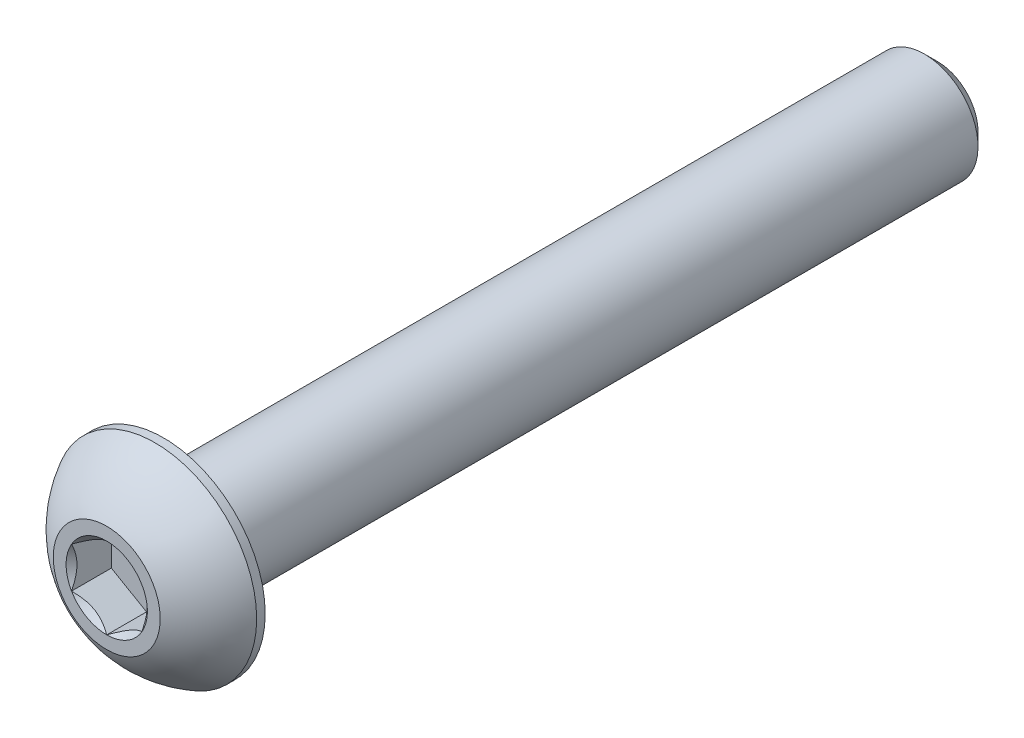
ISO-10303-21;
HEADER;
FILE_DESCRIPTION(('STEP AP214'),'2;1');
FILE_NAME('part.step','',(''),(''),'','','');
FILE_SCHEMA(('AUTOMOTIVE_DESIGN { 1 0 10303 214 1 1 1 1 }'));
ENDSEC;
DATA;
#1=APPLICATION_CONTEXT('core data for automotive mechanical design processes');
#2=APPLICATION_PROTOCOL_DEFINITION('international standard','automotive_design',2000,#1);
#3=PRODUCT_CONTEXT('',#1,'mechanical');
#4=PRODUCT('Part','Part','',(#3));
#5=PRODUCT_RELATED_PRODUCT_CATEGORY('part','',(#4));
#6=PRODUCT_DEFINITION_FORMATION('','',#4);
#7=PRODUCT_DEFINITION_CONTEXT('part definition',#1,'design');
#8=PRODUCT_DEFINITION('design','',#6,#7);
#9=PRODUCT_DEFINITION_SHAPE('','',#8);
#10=(LENGTH_UNIT() NAMED_UNIT(*) SI_UNIT(.MILLI.,.METRE.));
#11=(NAMED_UNIT(*) PLANE_ANGLE_UNIT() SI_UNIT($,.RADIAN.));
#12=(NAMED_UNIT(*) SI_UNIT($,.STERADIAN.) SOLID_ANGLE_UNIT());
#13=UNCERTAINTY_MEASURE_WITH_UNIT(LENGTH_MEASURE(1.E-05),#10,'distance_accuracy_value','');
#14=(GEOMETRIC_REPRESENTATION_CONTEXT(3) GLOBAL_UNCERTAINTY_ASSIGNED_CONTEXT((#13)) GLOBAL_UNIT_ASSIGNED_CONTEXT((#10,
#11,#12)) REPRESENTATION_CONTEXT('',''));
#15=CARTESIAN_POINT('',(0.,0.,0.));
#16=DIRECTION('',(0.,0.,1.));
#17=DIRECTION('',(1.,0.,0.));
#18=AXIS2_PLACEMENT_3D('',#15,#16,#17);
#19=CARTESIAN_POINT('',(0.,-2.413,-37.4904));
#20=DIRECTION('',(0.,0.,-1.));
#21=DIRECTION('',(0.,1.,0.));
#22=AXIS2_PLACEMENT_3D('',#19,#20,#21);
#23=PLANE('',#22);
#24=CARTESIAN_POINT('',(0.,0.,-37.4904));
#25=DIRECTION('',(0.,0.,-1.));
#26=DIRECTION('',(0.,1.,0.));
#27=AXIS2_PLACEMENT_3D('',#24,#25,#26);
#28=CIRCLE('',#27,1.8176875);
#29=CARTESIAN_POINT('',(0.,1.8176875,-37.4904));
#30=VERTEX_POINT('',#29);
#31=EDGE_CURVE('E44',#30,#30,#28,.T.);
#32=ORIENTED_EDGE('',*,*,#31,.T.);
#33=EDGE_LOOP('',(#32));
#34=FACE_BOUND('',#33,.T.);
#35=ADVANCED_FACE('F36',(#34),#23,.T.);
#36=CARTESIAN_POINT('',(0.,0.,-37.4904));
#37=DIRECTION('',(0.,0.,-1.));
#38=DIRECTION('',(0.,1.,0.));
#39=AXIS2_PLACEMENT_3D('',#36,#37,#38);
#40=CYLINDRICAL_SURFACE('',#39,2.413);
#41=CARTESIAN_POINT('',(0.,0.,-36.8950875));
#42=DIRECTION('',(0.,0.,-1.));
#43=DIRECTION('',(0.,1.,0.));
#44=AXIS2_PLACEMENT_3D('',#41,#42,#43);
#45=CIRCLE('',#44,2.413);
#46=CARTESIAN_POINT('',(0.,2.413,-36.8950875));
#47=VERTEX_POINT('',#46);
#48=EDGE_CURVE('E11',#47,#47,#45,.F.);
#49=ORIENTED_EDGE('',*,*,#48,.T.);
#50=EDGE_LOOP('',(#49));
#51=FACE_BOUND('',#50,.T.);
#52=CARTESIAN_POINT('',(0.,0.,-2.5654));
#53=DIRECTION('',(0.,0.,1.));
#54=DIRECTION('',(1.,0.,0.));
#55=AXIS2_PLACEMENT_3D('',#52,#53,#54);
#56=CIRCLE('',#55,2.413);
#57=CARTESIAN_POINT('',(2.413,0.,-2.5654));
#58=VERTEX_POINT('',#57);
#59=EDGE_CURVE('E170',#58,#58,#56,.F.);
#60=ORIENTED_EDGE('',*,*,#59,.T.);
#61=EDGE_LOOP('',(#60));
#62=FACE_BOUND('',#61,.T.);
#63=ADVANCED_FACE('F178',(#51,#62),#40,.T.);
#64=CARTESIAN_POINT('',(0.,0.,-37.4904));
#65=DIRECTION('',(0.,0.,1.));
#66=DIRECTION('',(0.,-1.,0.));
#67=AXIS2_PLACEMENT_3D('',#64,#65,#66);
#68=CONICAL_SURFACE('',#67,1.8176875,0.785398163397443);
#69=ORIENTED_EDGE('',*,*,#48,.F.);
#70=EDGE_LOOP('',(#69));
#71=FACE_BOUND('',#70,.T.);
#72=ORIENTED_EDGE('',*,*,#31,.F.);
#73=EDGE_LOOP('',(#72));
#74=FACE_BOUND('',#73,.T.);
#75=ADVANCED_FACE('F38',(#71,#74),#68,.T.);
#76=CARTESIAN_POINT('',(0.,0.,-4.5748806144438));
#77=DIRECTION('',(0.,0.,1.));
#78=DIRECTION('',(0.,-1.,0.));
#79=AXIS2_PLACEMENT_3D('',#76,#77,#78);
#80=SPHERICAL_SURFACE('',#79,5.17224338526463);
#81=CARTESIAN_POINT('',(0.,0.,0.));
#82=DIRECTION('',(0.,0.,1.));
#83=DIRECTION('',(1.,0.,0.));
#84=AXIS2_PLACEMENT_3D('',#81,#82,#83);
#85=CIRCLE('',#84,2.413);
#86=CARTESIAN_POINT('',(0.,-2.413,0.));
#87=VERTEX_POINT('',#86);
#88=EDGE_CURVE('E167',#87,#87,#85,.T.);
#89=CARTESIAN_POINT('',(0.,0.,-2.18059));
#90=DIRECTION('',(0.,0.,1.));
#91=DIRECTION('',(1.,0.,0.));
#92=AXIS2_PLACEMENT_3D('',#89,#90,#91);
#93=CIRCLE('',#92,4.5847);
#94=CARTESIAN_POINT('',(0.,-4.5847,-2.18059));
#95=VERTEX_POINT('',#94);
#96=EDGE_CURVE('E161',#95,#95,#93,.T.);
#97=CARTESIAN_POINT('',(0.,-2.413,0.));
#98=CARTESIAN_POINT('',(0.,-2.44179113663083,-0.0151857097788009));
#99=CARTESIAN_POINT('',(0.,-2.47043888331474,-0.0306432741933343));
#100=CARTESIAN_POINT('',(0.,-2.5274374690351,-0.0620964513369402));
#101=CARTESIAN_POINT('',(0.,-2.55578830807155,-0.0780920640660127));
#102=CARTESIAN_POINT('',(0.,-2.61218295074331,-0.110615676881771));
#103=CARTESIAN_POINT('',(0.,-2.64022675437863,-0.127143676968457));
#104=CARTESIAN_POINT('',(0.,-2.69599733629138,-0.160726162390165));
#105=CARTESIAN_POINT('',(0.,-2.72372411456882,-0.177780647725188));
#106=CARTESIAN_POINT('',(0.,-2.77885076121154,-0.21241002764294));
#107=CARTESIAN_POINT('',(0.,-2.80625062957682,-0.229984922225668));
#108=CARTESIAN_POINT('',(0.,-2.86071369040082,-0.265648855453746));
#109=CARTESIAN_POINT('',(0.,-2.88777688285954,-0.283737894099096));
#110=CARTESIAN_POINT('',(0.,-2.94155694533546,-0.320423667994127));
#111=CARTESIAN_POINT('',(0.,-2.96827381535265,-0.339020403243808));
#112=CARTESIAN_POINT('',(0.,-3.02135171000009,-0.37671494166065));
#113=CARTESIAN_POINT('',(0.,-3.04771273463033,-0.39581274482781));
#114=CARTESIAN_POINT('',(0.,-3.10006954235699,-0.434502611862808));
#115=CARTESIAN_POINT('',(0.,-3.12606532545341,-0.454094675730644));
#116=CARTESIAN_POINT('',(0.,-3.17768238416296,-0.493766080756604));
#117=CARTESIAN_POINT('',(0.,-3.20330365977609,-0.513845421914727));
#118=CARTESIAN_POINT('',(0.,-3.25416257105645,-0.554484224430573));
#119=CARTESIAN_POINT('',(0.,-3.27940020672367,-0.575043685788297));
#120=CARTESIAN_POINT('',(0.,-3.32948284239517,-0.616635400476975));
#121=CARTESIAN_POINT('',(0.,-3.35432784239946,-0.63766765380793));
#122=CARTESIAN_POINT('',(0.,-3.40361635097913,-0.680197455694829));
#123=CARTESIAN_POINT('',(0.,-3.42805985955453,-0.701695004250773));
#124=CARTESIAN_POINT('',(0.,-3.47653667261836,-0.745147733989217));
#125=CARTESIAN_POINT('',(0.,-3.5005699771068,-0.767102915171716));
#126=CARTESIAN_POINT('',(0.,-3.54821781555203,-0.81146308444603));
#127=CARTESIAN_POINT('',(0.,-3.57183234950881,-0.833868072537843));
#128=CARTESIAN_POINT('',(0.,-3.61863422971284,-0.879119869584105));
#129=CARTESIAN_POINT('',(0.,-3.64182157596008,-0.901966678538555));
#130=CARTESIAN_POINT('',(0.,-3.68776081583415,-0.948093973780533));
#131=CARTESIAN_POINT('',(0.,-3.71051270946098,-0.971374460068061));
#132=CARTESIAN_POINT('',(0.,-3.75557293439636,-1.01836081186645));
#133=CARTESIAN_POINT('',(0.,-3.7778812657049,-1.0420666773773));
#134=CARTESIAN_POINT('',(0.,-3.82204641440941,-1.08989533789018));
#135=CARTESIAN_POINT('',(0.,-3.84390323180538,-1.11401813289221));
#136=CARTESIAN_POINT('',(0.,-3.88715756202836,-1.16267205404467));
#137=CARTESIAN_POINT('',(0.,-3.90855507485536,-1.18720318019511));
#138=CARTESIAN_POINT('',(0.,-3.95088316899876,-1.23666501975588));
#139=CARTESIAN_POINT('',(0.,-3.97181375031515,-1.26159573316622));
#140=CARTESIAN_POINT('',(0.,-4.01320052092912,-1.31184786092909));
#141=CARTESIAN_POINT('',(0.,-4.03365671022669,-1.33716927528163));
#142=CARTESIAN_POINT('',(0.,-4.07408740538699,-1.38819377934977));
#143=CARTESIAN_POINT('',(0.,-4.09406191124973,-1.41389686906536));
#144=CARTESIAN_POINT('',(0.,-4.13352211981722,-1.46567556223513));
#145=CARTESIAN_POINT('',(0.,-4.15300782252198,-1.4917511656893));
#146=CARTESIAN_POINT('',(0.,-4.19148347927457,-1.54426559193551));
#147=CARTESIAN_POINT('',(0.,-4.2104734333224,-1.57070441472756));
#148=CARTESIAN_POINT('',(0.,-4.24795082398615,-1.6239358557723));
#149=CARTESIAN_POINT('',(0.,-4.26643826060207,-1.65072847402499));
#150=CARTESIAN_POINT('',(0.,-4.3029040266735,-1.70465795604563));
#151=CARTESIAN_POINT('',(0.,-4.32088235612901,-1.73179481981358));
#152=CARTESIAN_POINT('',(0.,-4.35632349988304,-1.78640312007115));
#153=CARTESIAN_POINT('',(0.,-4.37378631418156,-1.81387455656079));
#154=CARTESIAN_POINT('',(0.,-4.40819020238474,-1.86914221075438));
#155=CARTESIAN_POINT('',(0.,-4.42513127628939,-1.89693842845834));
#156=CARTESIAN_POINT('',(0.,-4.45848564813517,-1.95284573578717));
#157=CARTESIAN_POINT('',(0.,-4.4748989460763,-1.98095682541204));
#158=CARTESIAN_POINT('',(0.,-4.50719190474587,-2.03748386259807));
#159=CARTESIAN_POINT('',(0.,-4.5230715654743,-2.06589981015923));
#160=CARTESIAN_POINT('',(0.,-4.55429163018258,-2.12302641242262));
#161=CARTESIAN_POINT('',(0.,-4.56963203416241,-2.15173706712485));
#162=CARTESIAN_POINT('',(0.,-4.5847,-2.18059));
#163=B_SPLINE_CURVE_WITH_KNOTS('',3,(#97,#98,#99,#100,#101,#102,#103,#104,#105,#106,#107,#108,
#109,#110,#111,#112,#113,#114,#115,#116,#117,#118,#119,#120,#121,#122,#123,#124,#125,#126,#127,
#128,#129,#130,#131,#132,#133,#134,#135,#136,#137,#138,#139,#140,#141,#142,#143,#144,#145,#146,
#147,#148,#149,#150,#151,#152,#153,#154,#155,#156,#157,#158,#159,#160,#161,#162),.UNSPECIFIED.,
.F.,.F.,(4,2,2,2,2,2,2,2,2,2,2,2,2,2,2,2,2,2,2,2,2,2,2,2,2,2,2,2,2,2,2,2,4),(0.,
0.0976500604051489,0.195300120810298,0.292950181215447,0.390600241620598,0.488250302025747,
0.585900362430896,0.683550422836046,0.781200483241194,0.878850543646344,0.976500604051493,
1.07415066445664,1.17180072486179,1.26945078526694,1.36710084567209,1.46475090607724,
1.56240096648239,1.66005102688754,1.75770108729269,1.85535114769784,1.95300120810299,
2.05065126850814,2.14830132891329,2.24595138931843,2.34360144972358,2.44125151012873,
2.53890157053388,2.63655163093903,2.73420169134418,2.83185175174933,2.92950181215448,
3.02715187255963,3.12480193296478),.UNSPECIFIED.);
#164=EDGE_CURVE('BSEAM177',#87,#95,#163,.T.);
#165=ORIENTED_EDGE('',*,*,#88,.F.);
#166=ORIENTED_EDGE('',*,*,#96,.T.);
#167=ORIENTED_EDGE('',*,*,#164,.T.);
#168=ORIENTED_EDGE('',*,*,#164,.F.);
#169=EDGE_LOOP('',(#165,#167,#166,#168));
#170=FACE_BOUND('',#169,.T.);
#171=ADVANCED_FACE('F177',(#170),#80,.T.);
#172=CARTESIAN_POINT('',(0.,-2.413,0.));
#173=DIRECTION('',(0.,0.,-1.));
#174=DIRECTION('',(-1.,0.,0.));
#175=AXIS2_PLACEMENT_3D('',#172,#173,#174);
#176=PLANE('',#175);
#177=CARTESIAN_POINT('',(0.,0.,0.));
#178=DIRECTION('',(0.,0.,1.));
#179=DIRECTION('',(1.,0.,0.));
#180=AXIS2_PLACEMENT_3D('',#177,#178,#179);
#181=CIRCLE('',#180,1.83308710467706);
#182=CARTESIAN_POINT('',(-1.5875,0.91654355233853,0.));
#183=VERTEX_POINT('',#182);
#184=CARTESIAN_POINT('',(-1.5875,-0.916543552338531,0.));
#185=VERTEX_POINT('',#184);
#186=EDGE_CURVE('E57',#183,#185,#181,.T.);
#187=ORIENTED_EDGE('',*,*,#186,.F.);
#188=CARTESIAN_POINT('',(0.,1.83308710467706,0.));
#189=VERTEX_POINT('',#188);
#190=EDGE_CURVE('E131',#189,#183,#181,.T.);
#191=ORIENTED_EDGE('',*,*,#190,.F.);
#192=CARTESIAN_POINT('',(1.5875,0.916543552338531,0.));
#193=VERTEX_POINT('',#192);
#194=EDGE_CURVE('E108',#193,#189,#181,.T.);
#195=ORIENTED_EDGE('',*,*,#194,.F.);
#196=CARTESIAN_POINT('',(1.5875,-0.916543552338531,0.));
#197=VERTEX_POINT('',#196);
#198=EDGE_CURVE('E97',#197,#193,#181,.T.);
#199=ORIENTED_EDGE('',*,*,#198,.F.);
#200=CARTESIAN_POINT('',(0.,-1.83308710467706,0.));
#201=VERTEX_POINT('',#200);
#202=EDGE_CURVE('E89',#201,#197,#181,.T.);
#203=ORIENTED_EDGE('',*,*,#202,.F.);
#204=EDGE_CURVE('E50',#185,#201,#181,.T.);
#205=ORIENTED_EDGE('',*,*,#204,.F.);
#206=EDGE_LOOP('',(#187,#191,#195,#199,#203,#205));
#207=FACE_BOUND('',#206,.T.);
#208=ORIENTED_EDGE('',*,*,#88,.T.);
#209=EDGE_LOOP('',(#208));
#210=FACE_BOUND('',#209,.T.);
#211=ADVANCED_FACE('F128',(#207,#210),#176,.F.);
#212=CARTESIAN_POINT('',(0.,-4.5847,-2.5654));
#213=DIRECTION('',(0.,0.,1.));
#214=DIRECTION('',(1.,0.,0.));
#215=AXIS2_PLACEMENT_3D('',#212,#213,#214);
#216=PLANE('',#215);
#217=ORIENTED_EDGE('',*,*,#59,.F.);
#218=EDGE_LOOP('',(#217));
#219=FACE_BOUND('',#218,.T.);
#220=CARTESIAN_POINT('',(0.,0.,-2.5654));
#221=DIRECTION('',(0.,0.,1.));
#222=DIRECTION('',(1.,0.,0.));
#223=AXIS2_PLACEMENT_3D('',#220,#221,#222);
#224=CIRCLE('',#223,4.5847);
#225=CARTESIAN_POINT('',(4.5847,0.,-2.5654));
#226=VERTEX_POINT('',#225);
#227=EDGE_CURVE('E164',#226,#226,#224,.T.);
#228=ORIENTED_EDGE('',*,*,#227,.F.);
#229=EDGE_LOOP('',(#228));
#230=FACE_BOUND('',#229,.T.);
#231=ADVANCED_FACE('F195',(#219,#230),#216,.F.);
#232=CARTESIAN_POINT('',(0.,0.,0.));
#233=DIRECTION('',(0.,0.,1.));
#234=DIRECTION('',(1.,0.,0.));
#235=AXIS2_PLACEMENT_3D('',#232,#233,#234);
#236=CYLINDRICAL_SURFACE('',#235,4.5847);
#237=ORIENTED_EDGE('',*,*,#96,.F.);
#238=EDGE_LOOP('',(#237));
#239=FACE_BOUND('',#238,.T.);
#240=ORIENTED_EDGE('',*,*,#227,.T.);
#241=EDGE_LOOP('',(#240));
#242=FACE_BOUND('',#241,.T.);
#243=ADVANCED_FACE('F198',(#239,#242),#236,.T.);
#244=CARTESIAN_POINT('',(0.,0.,0.));
#245=DIRECTION('',(0.,0.,1.));
#246=DIRECTION('',(1.,0.,0.));
#247=AXIS2_PLACEMENT_3D('',#244,#245,#246);
#248=CONICAL_SURFACE('',#247,1.83308710467706,0.78539816339745);
#249=ORIENTED_EDGE('',*,*,#198,.T.);
#250=CARTESIAN_POINT('',(1.5875,-1.83163614232865,0.590762562254565));
#251=CARTESIAN_POINT('',(1.5875,-1.78705354844902,0.55707785480324));
#252=CARTESIAN_POINT('',(1.5875,-1.74222294150555,0.523722329968627));
#253=CARTESIAN_POINT('',(1.5875,-1.65196486784504,0.457805675888285));
#254=CARTESIAN_POINT('',(1.5875,-1.60653725449665,0.425244747634468));
#255=CARTESIAN_POINT('',(1.5875,-1.46854281940082,0.328493449461236));
#256=CARTESIAN_POINT('',(1.5875,-1.37494211623386,0.265753264612858));
#257=CARTESIAN_POINT('',(1.5875,-1.17864136265695,0.142553151294645));
#258=CARTESIAN_POINT('',(1.5875,-1.07572731596385,0.0824303289226488));
#259=CARTESIAN_POINT('',(1.5875,-0.864754189558117,-0.0275706334490079));
#260=CARTESIAN_POINT('',(1.5875,-0.756714033301438,-0.0774833149376714));
#261=CARTESIAN_POINT('',(1.5875,-0.594580029688666,-0.138547963751185));
#262=CARTESIAN_POINT('',(1.5875,-0.542894373932897,-0.156067797502568));
#263=CARTESIAN_POINT('',(1.5875,-0.43827206291756,-0.186958420156953));
#264=CARTESIAN_POINT('',(1.5875,-0.3853353220534,-0.200328924255393));
#265=CARTESIAN_POINT('',(1.5875,-0.27941340073437,-0.222002681044568));
#266=CARTESIAN_POINT('',(1.5875,-0.226446313904206,-0.230392976800141));
#267=CARTESIAN_POINT('',(1.5875,-0.119941637592404,-0.241941911012322));
#268=CARTESIAN_POINT('',(1.5875,-0.0664041486263234,-0.245101456366562));
#269=CARTESIAN_POINT('',(1.5875,0.0387581192420279,-0.245952982965122));
#270=CARTESIAN_POINT('',(1.5875,0.090381381554216,-0.243840334608509));
#271=CARTESIAN_POINT('',(1.5875,0.19318730201683,-0.234695846678065));
#272=CARTESIAN_POINT('',(1.5875,0.244369916988517,-0.227663530460197));
#273=CARTESIAN_POINT('',(1.5875,0.346790527788956,-0.208944949355169));
#274=CARTESIAN_POINT('',(1.5875,0.398013804172139,-0.197179358640977));
#275=CARTESIAN_POINT('',(1.5875,0.499340680307276,-0.169620657149212));
#276=CARTESIAN_POINT('',(1.5875,0.549444372105894,-0.153827878801824));
#277=CARTESIAN_POINT('',(1.5875,0.707022639586407,-0.0982133790717417));
#278=CARTESIAN_POINT('',(1.5875,0.812258737570578,-0.0520647672653368));
#279=CARTESIAN_POINT('',(1.5875,1.01778869013701,0.0505458403808823));
#280=CARTESIAN_POINT('',(1.5875,1.11806310933257,0.107044855107553));
#281=CARTESIAN_POINT('',(1.5875,1.30970442577157,0.223612502972616));
#282=CARTESIAN_POINT('',(1.5875,1.40126637149297,0.283364441978613));
#283=CARTESIAN_POINT('',(1.5875,1.53616443073864,0.37573700869171));
#284=CARTESIAN_POINT('',(1.5875,1.58054835823549,0.406854014274728));
#285=CARTESIAN_POINT('',(1.5875,1.66870952512132,0.469911550181166));
#286=CARTESIAN_POINT('',(1.5875,1.71248692801697,0.501851851647461));
#287=CARTESIAN_POINT('',(1.5875,1.75601179240957,0.534133557847131));
#288=B_SPLINE_CURVE_WITH_KNOTS('',3,(#250,#251,#252,#253,#254,#255,#256,#257,#258,#259,#260,
#261,#262,#263,#264,#265,#266,#267,#268,#269,#270,#271,#272,#273,#274,#275,#276,#277,#278,#279,
#280,#281,#282,#283,#284,#285,#286,#287),.UNSPECIFIED.,.F.,.F.,(4,2,2,2,2,2,2,2,2,2,2,2,2,2,2,2,
2,2,4),(0.,0.167627505127548,0.33529698084648,0.673194674702938,1.0304700708717,
1.38651603079307,1.55010049300858,1.71369618096554,1.87434127467533,2.034958513124,
2.18971280484453,2.34448209207484,2.50196108385089,2.65942708049529,3.00314617711216,
3.34811949873714,3.6759579216973,3.83856722085481,4.00113179576279),.UNSPECIFIED.);
#289=EDGE_CURVE('E102',#197,#193,#288,.T.);
#290=ORIENTED_EDGE('',*,*,#289,.F.);
#291=EDGE_LOOP('',(#249,#290));
#292=FACE_BOUND('',#291,.T.);
#293=ADVANCED_FACE('F103',(#292),#248,.F.);
#294=ORIENTED_EDGE('',*,*,#194,.T.);
#295=CARTESIAN_POINT('',(1.5877,0.916428082284693,0.000115480963706964));
#296=CARTESIAN_POINT('',(1.53312479190086,0.947937093371809,-0.0313691916294028));
#297=CARTESIAN_POINT('',(1.47763696320971,0.979973006203395,-0.0610049539864698));
#298=CARTESIAN_POINT('',(1.36449087915364,1.04529792829092,-0.115267739979175));
#299=CARTESIAN_POINT('',(1.30682185887062,1.07859315267522,-0.139864564866823));
#300=CARTESIAN_POINT('',(1.1905349781269,1.14573141457583,-0.181999635727418));
#301=CARTESIAN_POINT('',(1.13194674474407,1.17955734689075,-0.199643807270178));
#302=CARTESIAN_POINT('',(1.01348022674557,1.24795402294714,-0.226828529915031));
#303=CARTESIAN_POINT('',(0.953605562983896,1.28252267618758,-0.236389379304923));
#304=CARTESIAN_POINT('',(0.850418771876558,1.34209759781022,-0.245015586895992));
#305=CARTESIAN_POINT('',(0.807240015952288,1.36702686416637,-0.246292807190424));
#306=CARTESIAN_POINT('',(0.720953038535399,1.41684467380557,-0.244142944185295));
#307=CARTESIAN_POINT('',(0.677844847078612,1.44173319974742,-0.240714211450657));
#308=CARTESIAN_POINT('',(0.592046335002031,1.49126899379091,-0.229349005566657));
#309=CARTESIAN_POINT('',(0.549356408925407,1.51591603410293,-0.221408628198358));
#310=CARTESIAN_POINT('',(0.464693063478359,1.56479643938728,-0.201451585548899));
#311=CARTESIAN_POINT('',(0.422719959755075,1.58902962212064,-0.189433170791309));
#312=CARTESIAN_POINT('',(0.315211458113566,1.65109968448354,-0.153753102752754));
#313=CARTESIAN_POINT('',(0.2503427717089,1.68855163804125,-0.127401427696863));
#314=CARTESIAN_POINT('',(0.154961599380924,1.74361998356043,-0.082916463148298));
#315=CARTESIAN_POINT('',(0.123530699536157,1.76176662204668,-0.0672871421988686));
#316=CARTESIAN_POINT('',(0.0612469855696368,1.79772614107138,-0.0346015121388987));
#317=CARTESIAN_POINT('',(0.0303939039605763,1.8155391760437,-0.0175458843430302));
#318=CARTESIAN_POINT('',(-0.000200000000000412,1.8332025747309,0.000115480963706783));
#319=B_SPLINE_CURVE_WITH_KNOTS('',3,(#295,#296,#297,#298,#299,#300,#301,#302,#303,#304,#305,
#306,#307,#308,#309,#310,#311,#312,#313,#314,#315,#316,#317,#318),.UNSPECIFIED.,.F.,.F.,(4,2,2,
2,2,2,2,2,2,2,2,4),(0.,0.211482650810816,0.424197870807275,0.633533884524815,0.842342653263348,
0.99175555372714,1.14122083674204,1.29081565918877,1.44047473906437,1.6781878086972,
1.79671410024894,1.91518409436631),.UNSPECIFIED.);
#320=EDGE_CURVE('E107',#193,#189,#319,.T.);
#321=ORIENTED_EDGE('',*,*,#320,.F.);
#322=EDGE_LOOP('',(#294,#321));
#323=FACE_BOUND('',#322,.T.);
#324=ADVANCED_FACE('F289',(#323),#248,.F.);
#325=ORIENTED_EDGE('',*,*,#190,.T.);
#326=CARTESIAN_POINT('',(0.000199999999999602,1.8332025747309,0.000115480963706835));
#327=CARTESIAN_POINT('',(-0.0543752080991368,1.80169356364378,-0.031369191629403));
#328=CARTESIAN_POINT('',(-0.10986303679029,1.7696576508122,-0.06100495398647));
#329=CARTESIAN_POINT('',(-0.223009120846359,1.70433272872467,-0.115267739979175));
#330=CARTESIAN_POINT('',(-0.280678141129381,1.67103750434037,-0.139864564866824));
#331=CARTESIAN_POINT('',(-0.396965021873103,1.60389924243976,-0.181999635727418));
#332=CARTESIAN_POINT('',(-0.455553255255931,1.57007331012484,-0.199643807270178));
#333=CARTESIAN_POINT('',(-0.574019773254431,1.50167663406845,-0.226828529915031));
#334=CARTESIAN_POINT('',(-0.633894437016105,1.46710798082801,-0.236389379304923));
#335=CARTESIAN_POINT('',(-0.737081228123443,1.40753305920537,-0.245015586895992));
#336=CARTESIAN_POINT('',(-0.780259984047713,1.38260379284922,-0.246292807190424));
#337=CARTESIAN_POINT('',(-0.866546961464602,1.33278598321002,-0.244142944185295));
#338=CARTESIAN_POINT('',(-0.909655152921388,1.30789745726817,-0.240714211450657));
#339=CARTESIAN_POINT('',(-0.99545366499797,1.25836166322468,-0.229349005566657));
#340=CARTESIAN_POINT('',(-1.03814359107459,1.23371462291266,-0.221408628198358));
#341=CARTESIAN_POINT('',(-1.12280693652164,1.18483421762831,-0.201451585548899));
#342=CARTESIAN_POINT('',(-1.16478004024493,1.16060103489495,-0.189433170791309));
#343=CARTESIAN_POINT('',(-1.27228854188643,1.09853097253205,-0.153753102752754));
#344=CARTESIAN_POINT('',(-1.3371572282911,1.06107901897434,-0.127401427696863));
#345=CARTESIAN_POINT('',(-1.43253840061908,1.00601067345516,-0.082916463148298));
#346=CARTESIAN_POINT('',(-1.46396930046384,0.987864034968913,-0.0672871421988685));
#347=CARTESIAN_POINT('',(-1.52625301443036,0.951904515944214,-0.0346015121388985));
#348=CARTESIAN_POINT('',(-1.55710609603942,0.934091480971893,-0.0175458843430301));
#349=CARTESIAN_POINT('',(-1.5877,0.916428082284692,0.000115480963706555));
#350=B_SPLINE_CURVE_WITH_KNOTS('',3,(#326,#327,#328,#329,#330,#331,#332,#333,#334,#335,#336,
#337,#338,#339,#340,#341,#342,#343,#344,#345,#346,#347,#348,#349),.UNSPECIFIED.,.F.,.F.,(4,2,2,
2,2,2,2,2,2,2,2,4),(0.,0.211482650810816,0.424197870807276,0.633533884524816,0.842342653263348,
0.991755553727141,1.14122083674205,1.29081565918877,1.44047473906438,1.6781878086972,
1.79671410024894,1.91518409436631),.UNSPECIFIED.);
#351=EDGE_CURVE('E138',#189,#183,#350,.T.);
#352=ORIENTED_EDGE('',*,*,#351,.F.);
#353=EDGE_LOOP('',(#325,#352));
#354=FACE_BOUND('',#353,.T.);
#355=ADVANCED_FACE('F136',(#354),#248,.F.);
#356=ORIENTED_EDGE('',*,*,#186,.T.);
#357=CARTESIAN_POINT('',(-1.5875,-1.83163614232865,0.590762562254564));
#358=CARTESIAN_POINT('',(-1.5875,-1.78705354844902,0.557077854803239));
#359=CARTESIAN_POINT('',(-1.5875,-1.74222294150555,0.523722329968626));
#360=CARTESIAN_POINT('',(-1.5875,-1.65196486784504,0.457805675888285));
#361=CARTESIAN_POINT('',(-1.5875,-1.60653725449665,0.425244747634468));
#362=CARTESIAN_POINT('',(-1.5875,-1.46854281940082,0.328493449461235));
#363=CARTESIAN_POINT('',(-1.5875,-1.37494211623386,0.265753264612857));
#364=CARTESIAN_POINT('',(-1.5875,-1.17864136265695,0.142553151294644));
#365=CARTESIAN_POINT('',(-1.5875,-1.07572731596385,0.0824303289226486));
#366=CARTESIAN_POINT('',(-1.5875,-0.864754189558117,-0.0275706334490081));
#367=CARTESIAN_POINT('',(-1.5875,-0.756714033301438,-0.0774833149376718));
#368=CARTESIAN_POINT('',(-1.5875,-0.594580029688666,-0.138547963751185));
#369=CARTESIAN_POINT('',(-1.5875,-0.542894373932898,-0.156067797502568));
#370=CARTESIAN_POINT('',(-1.5875,-0.438272062917561,-0.186958420156953));
#371=CARTESIAN_POINT('',(-1.5875,-0.385335322053401,-0.200328924255393));
#372=CARTESIAN_POINT('',(-1.5875,-0.27941340073437,-0.222002681044568));
#373=CARTESIAN_POINT('',(-1.5875,-0.226446313904207,-0.230392976800141));
#374=CARTESIAN_POINT('',(-1.5875,-0.119941637592405,-0.241941911012322));
#375=CARTESIAN_POINT('',(-1.5875,-0.0664041486263238,-0.245101456366562));
#376=CARTESIAN_POINT('',(-1.5875,0.0387581192420274,-0.245952982965122));
#377=CARTESIAN_POINT('',(-1.5875,0.0903813815542156,-0.243840334608509));
#378=CARTESIAN_POINT('',(-1.5875,0.193187302016829,-0.234695846678065));
#379=CARTESIAN_POINT('',(-1.5875,0.244369916988516,-0.227663530460197));
#380=CARTESIAN_POINT('',(-1.5875,0.346790527788956,-0.208944949355169));
#381=CARTESIAN_POINT('',(-1.5875,0.398013804172139,-0.197179358640977));
#382=CARTESIAN_POINT('',(-1.5875,0.499340680307276,-0.169620657149213));
#383=CARTESIAN_POINT('',(-1.5875,0.549444372105893,-0.153827878801824));
#384=CARTESIAN_POINT('',(-1.5875,0.707022639586407,-0.0982133790717423));
#385=CARTESIAN_POINT('',(-1.5875,0.812258737570577,-0.0520647672653372));
#386=CARTESIAN_POINT('',(-1.5875,1.01778869013701,0.050545840380882));
#387=CARTESIAN_POINT('',(-1.5875,1.11806310933256,0.107044855107552));
#388=CARTESIAN_POINT('',(-1.5875,1.30970442577157,0.223612502972616));
#389=CARTESIAN_POINT('',(-1.5875,1.40126637149297,0.283364441978612));
#390=CARTESIAN_POINT('',(-1.5875,1.53616443073864,0.375737008691709));
#391=CARTESIAN_POINT('',(-1.5875,1.58054835823549,0.406854014274727));
#392=CARTESIAN_POINT('',(-1.5875,1.66870952512132,0.469911550181165));
#393=CARTESIAN_POINT('',(-1.5875,1.71248692801697,0.50185185164746));
#394=CARTESIAN_POINT('',(-1.5875,1.75601179240957,0.53413355784713));
#395=B_SPLINE_CURVE_WITH_KNOTS('',3,(#357,#358,#359,#360,#361,#362,#363,#364,#365,#366,#367,
#368,#369,#370,#371,#372,#373,#374,#375,#376,#377,#378,#379,#380,#381,#382,#383,#384,#385,#386,
#387,#388,#389,#390,#391,#392,#393,#394),.UNSPECIFIED.,.F.,.F.,(4,2,2,2,2,2,2,2,2,2,2,2,2,2,2,2,
2,2,4),(0.,0.167627505127548,0.335296980846479,0.673194674702938,1.0304700708717,
1.38651603079307,1.55010049300858,1.71369618096554,1.87434127467533,2.034958513124,
2.18971280484453,2.34448209207484,2.50196108385089,2.65942708049529,3.00314617711216,
3.34811949873714,3.67595792169729,3.83856722085481,4.00113179576279),.UNSPECIFIED.);
#396=EDGE_CURVE('E142',#183,#185,#395,.F.);
#397=ORIENTED_EDGE('',*,*,#396,.F.);
#398=EDGE_LOOP('',(#356,#397));
#399=FACE_BOUND('',#398,.T.);
#400=ADVANCED_FACE('F283',(#399),#248,.F.);
#401=ORIENTED_EDGE('',*,*,#204,.T.);
#402=CARTESIAN_POINT('',(-1.5877,-0.916428082284693,0.000115480963706531));
#403=CARTESIAN_POINT('',(-1.53312479190086,-0.947937093371809,-0.0313691916294031));
#404=CARTESIAN_POINT('',(-1.47763696320971,-0.979973006203394,-0.06100495398647));
#405=CARTESIAN_POINT('',(-1.36449087915364,-1.04529792829092,-0.115267739979175));
#406=CARTESIAN_POINT('',(-1.30682185887062,-1.07859315267522,-0.139864564866824));
#407=CARTESIAN_POINT('',(-1.1905349781269,-1.14573141457583,-0.181999635727418));
#408=CARTESIAN_POINT('',(-1.13194674474407,-1.17955734689075,-0.199643807270178));
#409=CARTESIAN_POINT('',(-1.01348022674557,-1.24795402294714,-0.226828529915031));
#410=CARTESIAN_POINT('',(-0.953605562983895,-1.28252267618758,-0.236389379304923));
#411=CARTESIAN_POINT('',(-0.850418771876558,-1.34209759781022,-0.245015586895992));
#412=CARTESIAN_POINT('',(-0.807240015952288,-1.36702686416637,-0.246292807190424));
#413=CARTESIAN_POINT('',(-0.720953038535399,-1.41684467380557,-0.244142944185295));
#414=CARTESIAN_POINT('',(-0.677844847078612,-1.44173319974742,-0.240714211450657));
#415=CARTESIAN_POINT('',(-0.592046335002031,-1.49126899379091,-0.229349005566657));
#416=CARTESIAN_POINT('',(-0.549356408925407,-1.51591603410293,-0.221408628198358));
#417=CARTESIAN_POINT('',(-0.464693063478359,-1.56479643938728,-0.201451585548899));
#418=CARTESIAN_POINT('',(-0.422719959755075,-1.58902962212064,-0.189433170791309));
#419=CARTESIAN_POINT('',(-0.315211458113566,-1.65109968448354,-0.153753102752754));
#420=CARTESIAN_POINT('',(-0.2503427717089,-1.68855163804125,-0.127401427696864));
#421=CARTESIAN_POINT('',(-0.154961599380924,-1.74361998356043,-0.082916463148298));
#422=CARTESIAN_POINT('',(-0.123530699536156,-1.76176662204668,-0.0672871421988684));
#423=CARTESIAN_POINT('',(-0.0612469855696366,-1.79772614107138,-0.0346015121388983));
#424=CARTESIAN_POINT('',(-0.030393903960576,-1.8155391760437,-0.0175458843430298));
#425=CARTESIAN_POINT('',(0.000200000000000753,-1.8332025747309,0.000115480963706965));
#426=B_SPLINE_CURVE_WITH_KNOTS('',3,(#402,#403,#404,#405,#406,#407,#408,#409,#410,#411,#412,
#413,#414,#415,#416,#417,#418,#419,#420,#421,#422,#423,#424,#425),.UNSPECIFIED.,.F.,.F.,(4,2,2,
2,2,2,2,2,2,2,2,4),(0.,0.211482650810816,0.424197870807275,0.633533884524815,0.842342653263347,
0.99175555372714,1.14122083674204,1.29081565918877,1.44047473906437,1.6781878086972,
1.79671410024894,1.91518409436631),.UNSPECIFIED.);
#427=EDGE_CURVE('E118',#185,#201,#426,.T.);
#428=ORIENTED_EDGE('',*,*,#427,.F.);
#429=EDGE_LOOP('',(#401,#428));
#430=FACE_BOUND('',#429,.T.);
#431=ADVANCED_FACE('F227',(#430),#248,.F.);
#432=ORIENTED_EDGE('',*,*,#202,.T.);
#433=CARTESIAN_POINT('',(-0.000199999999999123,-1.8332025747309,0.000115480963707269));
#434=CARTESIAN_POINT('',(0.0543752080991372,-1.80169356364378,-0.0313691916294027));
#435=CARTESIAN_POINT('',(0.109863036790291,-1.7696576508122,-0.0610049539864697));
#436=CARTESIAN_POINT('',(0.22300912084636,-1.70433272872467,-0.115267739979174));
#437=CARTESIAN_POINT('',(0.280678141129382,-1.67103750434037,-0.139864564866823));
#438=CARTESIAN_POINT('',(0.396965021873104,-1.60389924243976,-0.181999635727418));
#439=CARTESIAN_POINT('',(0.455553255255932,-1.57007331012484,-0.199643807270178));
#440=CARTESIAN_POINT('',(0.574019773254432,-1.50167663406845,-0.226828529915031));
#441=CARTESIAN_POINT('',(0.633894437016106,-1.46710798082801,-0.236389379304922));
#442=CARTESIAN_POINT('',(0.737081228123443,-1.40753305920537,-0.245015586895992));
#443=CARTESIAN_POINT('',(0.780259984047713,-1.38260379284922,-0.246292807190423));
#444=CARTESIAN_POINT('',(0.866546961464602,-1.33278598321002,-0.244142944185295));
#445=CARTESIAN_POINT('',(0.909655152921389,-1.30789745726817,-0.240714211450656));
#446=CARTESIAN_POINT('',(0.99545366499797,-1.25836166322468,-0.229349005566656));
#447=CARTESIAN_POINT('',(1.03814359107459,-1.23371462291266,-0.221408628198358));
#448=CARTESIAN_POINT('',(1.12280693652164,-1.18483421762831,-0.201451585548898));
#449=CARTESIAN_POINT('',(1.16478004024493,-1.16060103489495,-0.189433170791309));
#450=CARTESIAN_POINT('',(1.27228854188643,-1.09853097253205,-0.153753102752754));
#451=CARTESIAN_POINT('',(1.3371572282911,-1.06107901897434,-0.127401427696863));
#452=CARTESIAN_POINT('',(1.43253840061908,-1.00601067345516,-0.0829164631482976));
#453=CARTESIAN_POINT('',(1.46396930046384,-0.987864034968914,-0.0672871421988682));
#454=CARTESIAN_POINT('',(1.52625301443036,-0.951904515944214,-0.0346015121388983));
#455=CARTESIAN_POINT('',(1.55710609603942,-0.934091480971893,-0.0175458843430299));
#456=CARTESIAN_POINT('',(1.5877,-0.916428082284693,0.000115480963706771));
#457=B_SPLINE_CURVE_WITH_KNOTS('',3,(#433,#434,#435,#436,#437,#438,#439,#440,#441,#442,#443,
#444,#445,#446,#447,#448,#449,#450,#451,#452,#453,#454,#455,#456),.UNSPECIFIED.,.F.,.F.,(4,2,2,
2,2,2,2,2,2,2,2,4),(0.,0.211482650810816,0.424197870807276,0.633533884524815,0.842342653263348,
0.991755553727141,1.14122083674205,1.29081565918877,1.44047473906438,1.6781878086972,
1.79671410024894,1.91518409436631),.UNSPECIFIED.);
#458=EDGE_CURVE('E93',#201,#197,#457,.T.);
#459=ORIENTED_EDGE('',*,*,#458,.F.);
#460=EDGE_LOOP('',(#432,#459));
#461=FACE_BOUND('',#460,.T.);
#462=ADVANCED_FACE('F91',(#461),#248,.F.);
#463=CARTESIAN_POINT('',(1.5875,-0.916543552338531,-1.79578));
#464=DIRECTION('',(0.,0.,1.));
#465=DIRECTION('',(1.,0.,0.));
#466=AXIS2_PLACEMENT_3D('',#463,#464,#465);
#467=PLANE('',#466);
#468=DIRECTION('',(0.866025403784438,0.5,0.));
#469=VECTOR('',#468,1.);
#470=CARTESIAN_POINT('',(0.,-1.83308710467706,-1.79578));
#471=LINE('',#470,#469);
#472=CARTESIAN_POINT('',(0.,-1.83308710467706,-1.79578));
#473=VERTEX_POINT('',#472);
#474=CARTESIAN_POINT('',(1.5875,-0.916543552338531,-1.79578));
#475=VERTEX_POINT('',#474);
#476=EDGE_CURVE('E117',#473,#475,#471,.T.);
#477=ORIENTED_EDGE('',*,*,#476,.T.);
#478=DIRECTION('',(0.,1.,0.));
#479=VECTOR('',#478,1.);
#480=CARTESIAN_POINT('',(1.5875,-0.916543552338531,-1.79578));
#481=LINE('',#480,#479);
#482=CARTESIAN_POINT('',(1.5875,0.916543552338531,-1.79578));
#483=VERTEX_POINT('',#482);
#484=EDGE_CURVE('E122',#475,#483,#481,.T.);
#485=ORIENTED_EDGE('',*,*,#484,.T.);
#486=DIRECTION('',(-0.866025403784439,0.5,0.));
#487=VECTOR('',#486,1.);
#488=CARTESIAN_POINT('',(1.5875,0.916543552338531,-1.79578));
#489=LINE('',#488,#487);
#490=CARTESIAN_POINT('',(0.,1.83308710467706,-1.79578));
#491=VERTEX_POINT('',#490);
#492=EDGE_CURVE('E273',#483,#491,#489,.T.);
#493=ORIENTED_EDGE('',*,*,#492,.T.);
#494=DIRECTION('',(-0.866025403784438,-0.5,0.));
#495=VECTOR('',#494,1.);
#496=CARTESIAN_POINT('',(0.,1.83308710467706,-1.79578));
#497=LINE('',#496,#495);
#498=CARTESIAN_POINT('',(-1.5875,0.91654355233853,-1.79578));
#499=VERTEX_POINT('',#498);
#500=EDGE_CURVE('E152',#491,#499,#497,.T.);
#501=ORIENTED_EDGE('',*,*,#500,.T.);
#502=DIRECTION('',(0.,-1.,0.));
#503=VECTOR('',#502,1.);
#504=CARTESIAN_POINT('',(-1.5875,0.91654355233853,-1.79578));
#505=LINE('',#504,#503);
#506=CARTESIAN_POINT('',(-1.5875,-0.916543552338531,-1.79578));
#507=VERTEX_POINT('',#506);
#508=EDGE_CURVE('E277',#499,#507,#505,.T.);
#509=ORIENTED_EDGE('',*,*,#508,.T.);
#510=DIRECTION('',(0.866025403784439,-0.5,0.));
#511=VECTOR('',#510,1.);
#512=CARTESIAN_POINT('',(-1.5875,-0.916543552338531,-1.79578));
#513=LINE('',#512,#511);
#514=EDGE_CURVE('E125',#507,#473,#513,.T.);
#515=ORIENTED_EDGE('',*,*,#514,.T.);
#516=EDGE_LOOP('',(#477,#485,#493,#501,#509,#515));
#517=FACE_BOUND('',#516,.T.);
#518=ADVANCED_FACE('F226',(#517),#467,.T.);
#519=CARTESIAN_POINT('',(1.5875,-0.916543552338531,-1.79578));
#520=DIRECTION('',(1.,0.,0.));
#521=DIRECTION('',(0.,0.,-1.));
#522=AXIS2_PLACEMENT_3D('',#519,#520,#521);
#523=PLANE('',#522);
#524=DIRECTION('',(0.,0.,1.));
#525=VECTOR('',#524,1.);
#526=CARTESIAN_POINT('',(1.5875,-0.916543552338531,-1.79578));
#527=LINE('',#526,#525);
#528=EDGE_CURVE('E114',#475,#197,#527,.T.);
#529=ORIENTED_EDGE('',*,*,#528,.T.);
#530=ORIENTED_EDGE('',*,*,#289,.T.);
#531=DIRECTION('',(0.,0.,1.));
#532=VECTOR('',#531,1.);
#533=CARTESIAN_POINT('',(1.5875,0.916543552338531,-1.79578));
#534=LINE('',#533,#532);
#535=EDGE_CURVE('E124',#483,#193,#534,.T.);
#536=ORIENTED_EDGE('',*,*,#535,.F.);
#537=ORIENTED_EDGE('',*,*,#484,.F.);
#538=EDGE_LOOP('',(#529,#530,#536,#537));
#539=FACE_BOUND('',#538,.T.);
#540=ADVANCED_FACE('F120',(#539),#523,.F.);
#541=CARTESIAN_POINT('',(1.5875,0.916543552338531,-1.79578));
#542=DIRECTION('',(0.5,0.866025403784439,0.));
#543=DIRECTION('',(-0.866025403784439,0.5,0.));
#544=AXIS2_PLACEMENT_3D('',#541,#542,#543);
#545=PLANE('',#544);
#546=ORIENTED_EDGE('',*,*,#535,.T.);
#547=ORIENTED_EDGE('',*,*,#320,.T.);
#548=DIRECTION('',(0.,0.,1.));
#549=VECTOR('',#548,1.);
#550=CARTESIAN_POINT('',(0.,1.83308710467706,-1.79578));
#551=LINE('',#550,#549);
#552=EDGE_CURVE('E147',#491,#189,#551,.T.);
#553=ORIENTED_EDGE('',*,*,#552,.F.);
#554=ORIENTED_EDGE('',*,*,#492,.F.);
#555=EDGE_LOOP('',(#546,#547,#553,#554));
#556=FACE_BOUND('',#555,.T.);
#557=ADVANCED_FACE('F145',(#556),#545,.F.);
#558=CARTESIAN_POINT('',(0.,1.83308710467706,-1.79578));
#559=DIRECTION('',(-0.5,0.866025403784438,0.));
#560=DIRECTION('',(-0.866025403784439,-0.5,0.));
#561=AXIS2_PLACEMENT_3D('',#558,#559,#560);
#562=PLANE('',#561);
#563=ORIENTED_EDGE('',*,*,#552,.T.);
#564=ORIENTED_EDGE('',*,*,#351,.T.);
#565=DIRECTION('',(0.,0.,1.));
#566=VECTOR('',#565,1.);
#567=CARTESIAN_POINT('',(-1.5875,0.91654355233853,-1.79578));
#568=LINE('',#567,#566);
#569=EDGE_CURVE('E154',#499,#183,#568,.T.);
#570=ORIENTED_EDGE('',*,*,#569,.F.);
#571=ORIENTED_EDGE('',*,*,#500,.F.);
#572=EDGE_LOOP('',(#563,#564,#570,#571));
#573=FACE_BOUND('',#572,.T.);
#574=ADVANCED_FACE('F150',(#573),#562,.F.);
#575=CARTESIAN_POINT('',(-1.5875,0.91654355233853,-1.79578));
#576=DIRECTION('',(-1.,0.,0.));
#577=DIRECTION('',(0.,-1.,0.));
#578=AXIS2_PLACEMENT_3D('',#575,#576,#577);
#579=PLANE('',#578);
#580=ORIENTED_EDGE('',*,*,#569,.T.);
#581=ORIENTED_EDGE('',*,*,#396,.T.);
#582=DIRECTION('',(0.,0.,1.));
#583=VECTOR('',#582,1.);
#584=CARTESIAN_POINT('',(-1.5875,-0.916543552338531,-1.79578));
#585=LINE('',#584,#583);
#586=EDGE_CURVE('E156',#507,#185,#585,.T.);
#587=ORIENTED_EDGE('',*,*,#586,.F.);
#588=ORIENTED_EDGE('',*,*,#508,.F.);
#589=EDGE_LOOP('',(#580,#581,#587,#588));
#590=FACE_BOUND('',#589,.T.);
#591=ADVANCED_FACE('F252',(#590),#579,.F.);
#592=CARTESIAN_POINT('',(-1.5875,-0.916543552338531,-1.79578));
#593=DIRECTION('',(-0.5,-0.866025403784439,0.));
#594=DIRECTION('',(0.866025403784439,-0.5,0.));
#595=AXIS2_PLACEMENT_3D('',#592,#593,#594);
#596=PLANE('',#595);
#597=ORIENTED_EDGE('',*,*,#586,.T.);
#598=ORIENTED_EDGE('',*,*,#427,.T.);
#599=DIRECTION('',(0.,0.,1.));
#600=VECTOR('',#599,1.);
#601=CARTESIAN_POINT('',(0.,-1.83308710467706,-1.79578));
#602=LINE('',#601,#600);
#603=EDGE_CURVE('E116',#473,#201,#602,.T.);
#604=ORIENTED_EDGE('',*,*,#603,.F.);
#605=ORIENTED_EDGE('',*,*,#514,.F.);
#606=EDGE_LOOP('',(#597,#598,#604,#605));
#607=FACE_BOUND('',#606,.T.);
#608=ADVANCED_FACE('F206',(#607),#596,.F.);
#609=CARTESIAN_POINT('',(0.,-1.83308710467706,-1.79578));
#610=DIRECTION('',(0.5,-0.866025403784438,0.));
#611=DIRECTION('',(0.866025403784438,0.5,0.));
#612=AXIS2_PLACEMENT_3D('',#609,#610,#611);
#613=PLANE('',#612);
#614=ORIENTED_EDGE('',*,*,#603,.T.);
#615=ORIENTED_EDGE('',*,*,#458,.T.);
#616=ORIENTED_EDGE('',*,*,#528,.F.);
#617=ORIENTED_EDGE('',*,*,#476,.F.);
#618=EDGE_LOOP('',(#614,#615,#616,#617));
#619=FACE_BOUND('',#618,.T.);
#620=ADVANCED_FACE('F112',(#619),#613,.F.);
#621=CLOSED_SHELL('',(#35,#63,#75,#171,#211,#231,#243,#293,#324,#355,#400,#431,#462,#518,#540,
#557,#574,#591,#608,#620));
#622=MANIFOLD_SOLID_BREP('B2',#621);
#623=ADVANCED_BREP_SHAPE_REPRESENTATION('',(#18,#622),#14);
#624=SHAPE_DEFINITION_REPRESENTATION(#9,#623);
ENDSEC;
END-ISO-10303-21;
